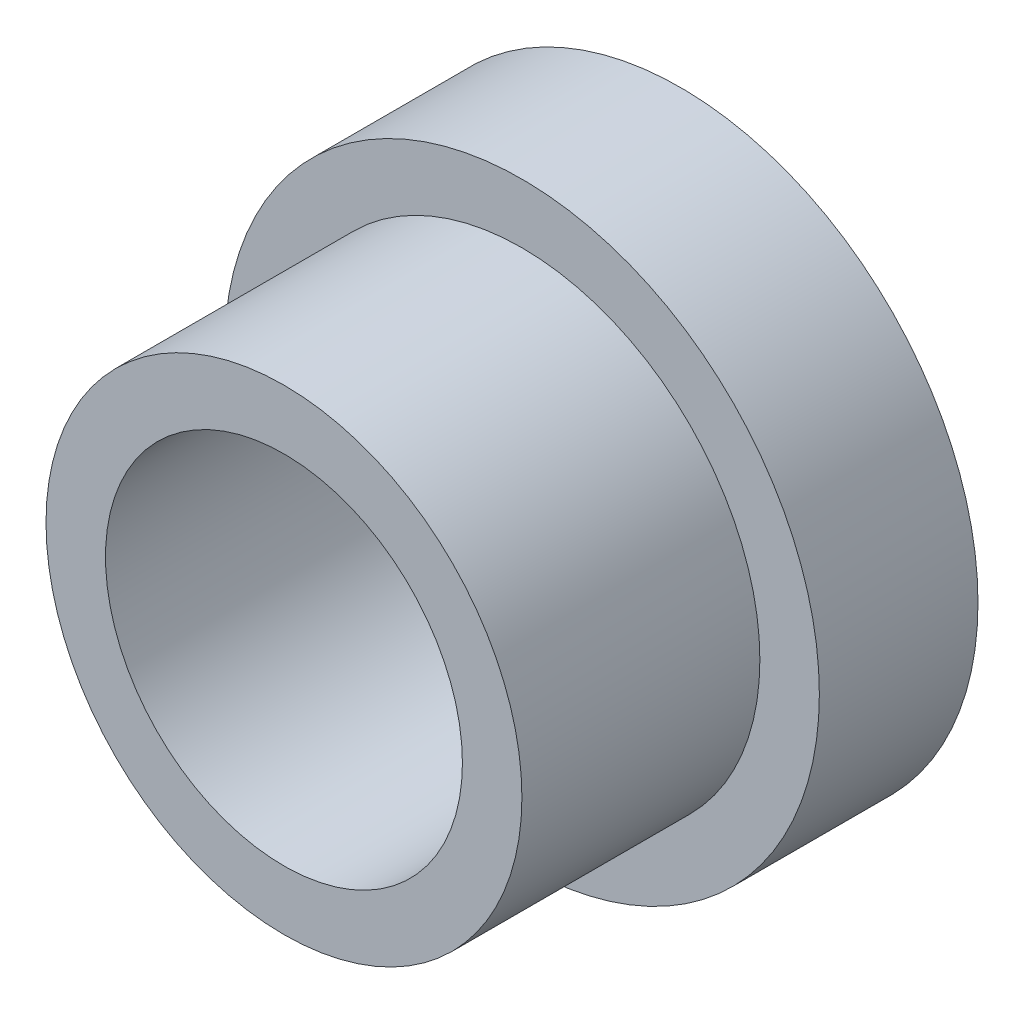
ISO-10303-21;
HEADER;
FILE_DESCRIPTION(('STEP AP214'),'2;1');
FILE_NAME('part.step','',(''),(''),'','','');
FILE_SCHEMA(('AUTOMOTIVE_DESIGN { 1 0 10303 214 1 1 1 1 }'));
ENDSEC;
DATA;
#1=APPLICATION_CONTEXT('core data for automotive mechanical design processes');
#2=APPLICATION_PROTOCOL_DEFINITION('international standard','automotive_design',2000,#1);
#3=PRODUCT_CONTEXT('',#1,'mechanical');
#4=PRODUCT('Part','Part','',(#3));
#5=PRODUCT_RELATED_PRODUCT_CATEGORY('part','',(#4));
#6=PRODUCT_DEFINITION_FORMATION('','',#4);
#7=PRODUCT_DEFINITION_CONTEXT('part definition',#1,'design');
#8=PRODUCT_DEFINITION('design','',#6,#7);
#9=PRODUCT_DEFINITION_SHAPE('','',#8);
#10=(LENGTH_UNIT() NAMED_UNIT(*) SI_UNIT(.MILLI.,.METRE.));
#11=(NAMED_UNIT(*) PLANE_ANGLE_UNIT() SI_UNIT($,.RADIAN.));
#12=(NAMED_UNIT(*) SI_UNIT($,.STERADIAN.) SOLID_ANGLE_UNIT());
#13=UNCERTAINTY_MEASURE_WITH_UNIT(LENGTH_MEASURE(1.E-05),#10,'distance_accuracy_value','');
#14=(GEOMETRIC_REPRESENTATION_CONTEXT(3) GLOBAL_UNCERTAINTY_ASSIGNED_CONTEXT((#13)) GLOBAL_UNIT_ASSIGNED_CONTEXT((#10,
#11,#12)) REPRESENTATION_CONTEXT('',''));
#15=CARTESIAN_POINT('',(0.,0.,0.));
#16=DIRECTION('',(0.,0.,1.));
#17=DIRECTION('',(1.,0.,0.));
#18=AXIS2_PLACEMENT_3D('',#15,#16,#17);
#19=CARTESIAN_POINT('',(0.,0.,4.));
#20=DIRECTION('',(0.,0.,-1.));
#21=DIRECTION('',(-1.,0.,0.));
#22=AXIS2_PLACEMENT_3D('',#19,#20,#21);
#23=CYLINDRICAL_SURFACE('',#22,7.5);
#24=CARTESIAN_POINT('',(0.,0.,4.));
#25=DIRECTION('',(0.,0.,1.));
#26=DIRECTION('',(1.,0.,0.));
#27=AXIS2_PLACEMENT_3D('',#24,#25,#26);
#28=CIRCLE('',#27,7.5);
#29=CARTESIAN_POINT('',(7.5,0.,4.));
#30=VERTEX_POINT('',#29);
#31=EDGE_CURVE('E40',#30,#30,#28,.T.);
#32=ORIENTED_EDGE('',*,*,#31,.F.);
#33=EDGE_LOOP('',(#32));
#34=FACE_BOUND('',#33,.T.);
#35=CARTESIAN_POINT('',(0.,0.,0.));
#36=DIRECTION('',(0.,0.,1.));
#37=DIRECTION('',(1.,0.,0.));
#38=AXIS2_PLACEMENT_3D('',#35,#36,#37);
#39=CIRCLE('',#38,7.5);
#40=CARTESIAN_POINT('',(7.5,0.,0.));
#41=VERTEX_POINT('',#40);
#42=EDGE_CURVE('E36',#41,#41,#39,.T.);
#43=ORIENTED_EDGE('',*,*,#42,.T.);
#44=EDGE_LOOP('',(#43));
#45=FACE_BOUND('',#44,.T.);
#46=ADVANCED_FACE('F33',(#34,#45),#23,.T.);
#47=CARTESIAN_POINT('',(0.,0.,4.));
#48=DIRECTION('',(0.,0.,1.));
#49=DIRECTION('',(1.,0.,0.));
#50=AXIS2_PLACEMENT_3D('',#47,#48,#49);
#51=PLANE('',#50);
#52=CARTESIAN_POINT('',(0.,0.,4.));
#53=DIRECTION('',(0.,0.,1.));
#54=DIRECTION('',(1.,0.,0.));
#55=AXIS2_PLACEMENT_3D('',#52,#53,#54);
#56=CIRCLE('',#55,6.);
#57=CARTESIAN_POINT('',(6.,0.,4.));
#58=VERTEX_POINT('',#57);
#59=EDGE_CURVE('E10',#58,#58,#56,.T.);
#60=ORIENTED_EDGE('',*,*,#59,.F.);
#61=EDGE_LOOP('',(#60));
#62=FACE_BOUND('',#61,.T.);
#63=ORIENTED_EDGE('',*,*,#31,.T.);
#64=EDGE_LOOP('',(#63));
#65=FACE_BOUND('',#64,.T.);
#66=ADVANCED_FACE('F77',(#62,#65),#51,.T.);
#67=CARTESIAN_POINT('',(0.,0.,0.));
#68=DIRECTION('',(0.,0.,1.));
#69=DIRECTION('',(1.,0.,0.));
#70=AXIS2_PLACEMENT_3D('',#67,#68,#69);
#71=PLANE('',#70);
#72=CARTESIAN_POINT('',(0.,0.,0.));
#73=DIRECTION('',(0.,0.,1.));
#74=DIRECTION('',(1.,0.,0.));
#75=AXIS2_PLACEMENT_3D('',#72,#73,#74);
#76=CIRCLE('',#75,4.5);
#77=CARTESIAN_POINT('',(4.5,0.,0.));
#78=VERTEX_POINT('',#77);
#79=EDGE_CURVE('E49',#78,#78,#76,.T.);
#80=ORIENTED_EDGE('',*,*,#79,.T.);
#81=EDGE_LOOP('',(#80));
#82=FACE_BOUND('',#81,.T.);
#83=ORIENTED_EDGE('',*,*,#42,.F.);
#84=EDGE_LOOP('',(#83));
#85=FACE_BOUND('',#84,.T.);
#86=ADVANCED_FACE('F56',(#82,#85),#71,.F.);
#87=CARTESIAN_POINT('',(0.,0.,10.));
#88=DIRECTION('',(0.,0.,-1.));
#89=DIRECTION('',(-1.,0.,0.));
#90=AXIS2_PLACEMENT_3D('',#87,#88,#89);
#91=CYLINDRICAL_SURFACE('',#90,6.);
#92=CARTESIAN_POINT('',(0.,0.,10.));
#93=DIRECTION('',(0.,0.,1.));
#94=DIRECTION('',(1.,0.,0.));
#95=AXIS2_PLACEMENT_3D('',#92,#93,#94);
#96=CIRCLE('',#95,6.);
#97=CARTESIAN_POINT('',(6.,0.,10.));
#98=VERTEX_POINT('',#97);
#99=EDGE_CURVE('E46',#98,#98,#96,.T.);
#100=ORIENTED_EDGE('',*,*,#99,.F.);
#101=EDGE_LOOP('',(#100));
#102=FACE_BOUND('',#101,.T.);
#103=ORIENTED_EDGE('',*,*,#59,.T.);
#104=EDGE_LOOP('',(#103));
#105=FACE_BOUND('',#104,.T.);
#106=ADVANCED_FACE('F68',(#102,#105),#91,.T.);
#107=CARTESIAN_POINT('',(0.,0.,10.));
#108=DIRECTION('',(0.,0.,1.));
#109=DIRECTION('',(1.,0.,0.));
#110=AXIS2_PLACEMENT_3D('',#107,#108,#109);
#111=PLANE('',#110);
#112=CARTESIAN_POINT('',(0.,0.,10.));
#113=DIRECTION('',(0.,0.,1.));
#114=DIRECTION('',(1.,0.,0.));
#115=AXIS2_PLACEMENT_3D('',#112,#113,#114);
#116=CIRCLE('',#115,4.5);
#117=CARTESIAN_POINT('',(4.5,0.,10.));
#118=VERTEX_POINT('',#117);
#119=EDGE_CURVE('E50',#118,#118,#116,.T.);
#120=ORIENTED_EDGE('',*,*,#119,.F.);
#121=EDGE_LOOP('',(#120));
#122=FACE_BOUND('',#121,.T.);
#123=ORIENTED_EDGE('',*,*,#99,.T.);
#124=EDGE_LOOP('',(#123));
#125=FACE_BOUND('',#124,.T.);
#126=ADVANCED_FACE('F62',(#122,#125),#111,.T.);
#127=CARTESIAN_POINT('',(0.,0.,0.));
#128=DIRECTION('',(0.,0.,1.));
#129=DIRECTION('',(1.,0.,0.));
#130=AXIS2_PLACEMENT_3D('',#127,#128,#129);
#131=CYLINDRICAL_SURFACE('',#130,4.5);
#132=ORIENTED_EDGE('',*,*,#79,.F.);
#133=EDGE_LOOP('',(#132));
#134=FACE_BOUND('',#133,.T.);
#135=ORIENTED_EDGE('',*,*,#119,.T.);
#136=EDGE_LOOP('',(#135));
#137=FACE_BOUND('',#136,.T.);
#138=ADVANCED_FACE('F59',(#134,#137),#131,.F.);
#139=CLOSED_SHELL('',(#46,#66,#86,#106,#126,#138));
#140=MANIFOLD_SOLID_BREP('B2',#139);
#141=ADVANCED_BREP_SHAPE_REPRESENTATION('',(#18,#140),#14);
#142=SHAPE_DEFINITION_REPRESENTATION(#9,#141);
ENDSEC;
END-ISO-10303-21;
